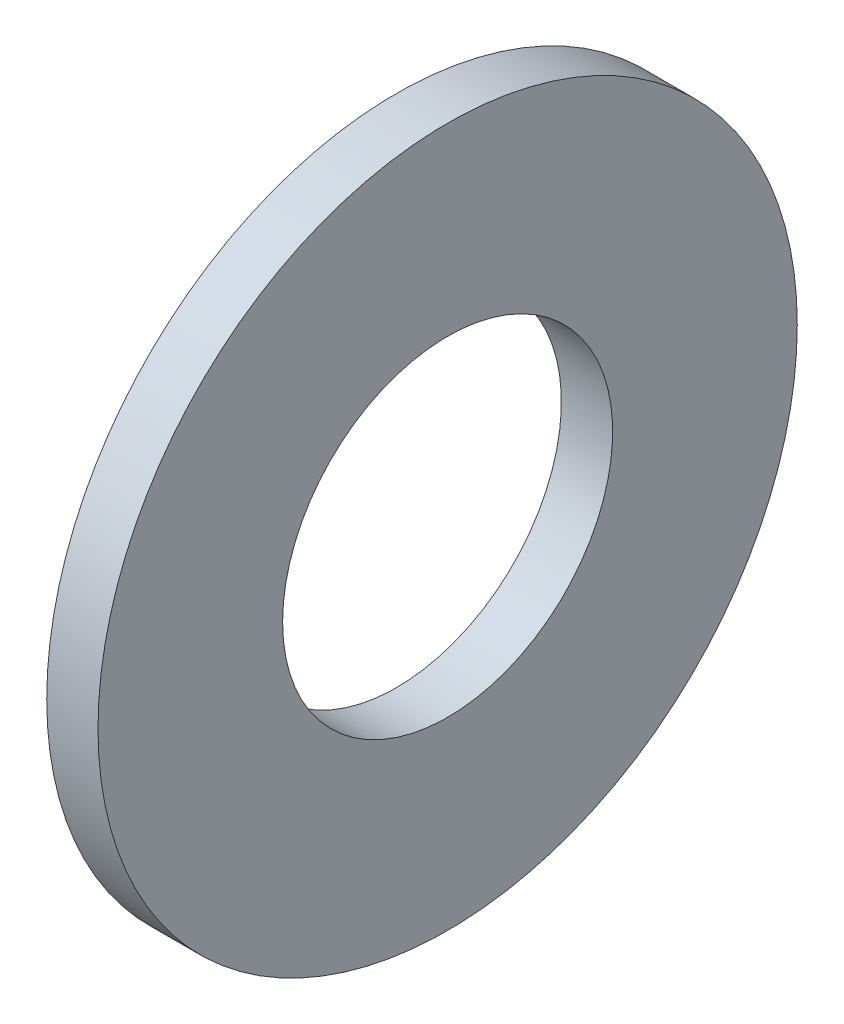
ISO-10303-21;
HEADER;
FILE_DESCRIPTION(('STEP AP214'),'2;1');
FILE_NAME('part.step','',(''),(''),'','','');
FILE_SCHEMA(('AUTOMOTIVE_DESIGN { 1 0 10303 214 1 1 1 1 }'));
ENDSEC;
DATA;
#1=APPLICATION_CONTEXT('core data for automotive mechanical design processes');
#2=APPLICATION_PROTOCOL_DEFINITION('international standard','automotive_design',2000,#1);
#3=PRODUCT_CONTEXT('',#1,'mechanical');
#4=PRODUCT('Part','Part','',(#3));
#5=PRODUCT_RELATED_PRODUCT_CATEGORY('part','',(#4));
#6=PRODUCT_DEFINITION_FORMATION('','',#4);
#7=PRODUCT_DEFINITION_CONTEXT('part definition',#1,'design');
#8=PRODUCT_DEFINITION('design','',#6,#7);
#9=PRODUCT_DEFINITION_SHAPE('','',#8);
#10=(LENGTH_UNIT() NAMED_UNIT(*) SI_UNIT(.MILLI.,.METRE.));
#11=(NAMED_UNIT(*) PLANE_ANGLE_UNIT() SI_UNIT($,.RADIAN.));
#12=(NAMED_UNIT(*) SI_UNIT($,.STERADIAN.) SOLID_ANGLE_UNIT());
#13=UNCERTAINTY_MEASURE_WITH_UNIT(LENGTH_MEASURE(1.E-05),#10,'distance_accuracy_value','');
#14=(GEOMETRIC_REPRESENTATION_CONTEXT(3) GLOBAL_UNCERTAINTY_ASSIGNED_CONTEXT((#13)) GLOBAL_UNIT_ASSIGNED_CONTEXT((#10,
#11,#12)) REPRESENTATION_CONTEXT('',''));
#15=CARTESIAN_POINT('',(0.,0.,0.));
#16=DIRECTION('',(0.,0.,1.));
#17=DIRECTION('',(1.,0.,0.));
#18=AXIS2_PLACEMENT_3D('',#15,#16,#17);
#19=CARTESIAN_POINT('',(-34.9249999999999,0.,0.));
#20=DIRECTION('',(-1.,0.,0.));
#21=DIRECTION('',(0.,0.,1.));
#22=AXIS2_PLACEMENT_3D('',#19,#20,#21);
#23=CYLINDRICAL_SURFACE('',#22,13.4874);
#24=CARTESIAN_POINT('',(0.,0.,0.));
#25=DIRECTION('',(-1.,0.,0.));
#26=DIRECTION('',(0.,0.,1.));
#27=AXIS2_PLACEMENT_3D('',#24,#25,#26);
#28=CIRCLE('',#27,13.4874);
#29=CARTESIAN_POINT('',(0.,0.,13.4874));
#30=VERTEX_POINT('',#29);
#31=EDGE_CURVE('E10',#30,#30,#28,.T.);
#32=ORIENTED_EDGE('',*,*,#31,.F.);
#33=EDGE_LOOP('',(#32));
#34=FACE_BOUND('',#33,.T.);
#35=CARTESIAN_POINT('',(-4.191,0.,0.));
#36=DIRECTION('',(-1.,0.,0.));
#37=DIRECTION('',(0.,0.,1.));
#38=AXIS2_PLACEMENT_3D('',#35,#36,#37);
#39=CIRCLE('',#38,13.4874);
#40=CARTESIAN_POINT('',(-4.191,0.,13.4874));
#41=VERTEX_POINT('',#40);
#42=EDGE_CURVE('E44',#41,#41,#39,.T.);
#43=ORIENTED_EDGE('',*,*,#42,.T.);
#44=EDGE_LOOP('',(#43));
#45=FACE_BOUND('',#44,.T.);
#46=ADVANCED_FACE('F30',(#34,#45),#23,.F.);
#47=CARTESIAN_POINT('',(0.,13.4874,0.));
#48=DIRECTION('',(-1.,0.,0.));
#49=DIRECTION('',(0.,0.,1.));
#50=AXIS2_PLACEMENT_3D('',#47,#48,#49);
#51=PLANE('',#50);
#52=CARTESIAN_POINT('',(0.,0.,0.));
#53=DIRECTION('',(-1.,0.,0.));
#54=DIRECTION('',(0.,0.,1.));
#55=AXIS2_PLACEMENT_3D('',#52,#53,#54);
#56=CIRCLE('',#55,28.575);
#57=CARTESIAN_POINT('',(0.,0.,28.575));
#58=VERTEX_POINT('',#57);
#59=EDGE_CURVE('E36',#58,#58,#56,.T.);
#60=ORIENTED_EDGE('',*,*,#59,.F.);
#61=EDGE_LOOP('',(#60));
#62=FACE_BOUND('',#61,.T.);
#63=ORIENTED_EDGE('',*,*,#31,.T.);
#64=EDGE_LOOP('',(#63));
#65=FACE_BOUND('',#64,.T.);
#66=ADVANCED_FACE('F59',(#62,#65),#51,.F.);
#67=CARTESIAN_POINT('',(-34.9249999999999,0.,0.));
#68=DIRECTION('',(-1.,0.,0.));
#69=DIRECTION('',(0.,0.,1.));
#70=AXIS2_PLACEMENT_3D('',#67,#68,#69);
#71=CYLINDRICAL_SURFACE('',#70,28.575);
#72=CARTESIAN_POINT('',(-4.191,0.,0.));
#73=DIRECTION('',(-1.,0.,0.));
#74=DIRECTION('',(0.,0.,1.));
#75=AXIS2_PLACEMENT_3D('',#72,#73,#74);
#76=CIRCLE('',#75,28.575);
#77=CARTESIAN_POINT('',(-4.191,0.,28.575));
#78=VERTEX_POINT('',#77);
#79=EDGE_CURVE('E40',#78,#78,#76,.T.);
#80=ORIENTED_EDGE('',*,*,#79,.F.);
#81=EDGE_LOOP('',(#80));
#82=FACE_BOUND('',#81,.T.);
#83=ORIENTED_EDGE('',*,*,#59,.T.);
#84=EDGE_LOOP('',(#83));
#85=FACE_BOUND('',#84,.T.);
#86=ADVANCED_FACE('F54',(#82,#85),#71,.T.);
#87=CARTESIAN_POINT('',(-4.191,28.575,0.));
#88=DIRECTION('',(1.,0.,0.));
#89=DIRECTION('',(0.,0.,-1.));
#90=AXIS2_PLACEMENT_3D('',#87,#88,#89);
#91=PLANE('',#90);
#92=ORIENTED_EDGE('',*,*,#42,.F.);
#93=EDGE_LOOP('',(#92));
#94=FACE_BOUND('',#93,.T.);
#95=ORIENTED_EDGE('',*,*,#79,.T.);
#96=EDGE_LOOP('',(#95));
#97=FACE_BOUND('',#96,.T.);
#98=ADVANCED_FACE('F51',(#94,#97),#91,.F.);
#99=CLOSED_SHELL('',(#46,#66,#86,#98));
#100=MANIFOLD_SOLID_BREP('B2',#99);
#101=ADVANCED_BREP_SHAPE_REPRESENTATION('',(#18,#100),#14);
#102=SHAPE_DEFINITION_REPRESENTATION(#9,#101);
ENDSEC;
END-ISO-10303-21;
